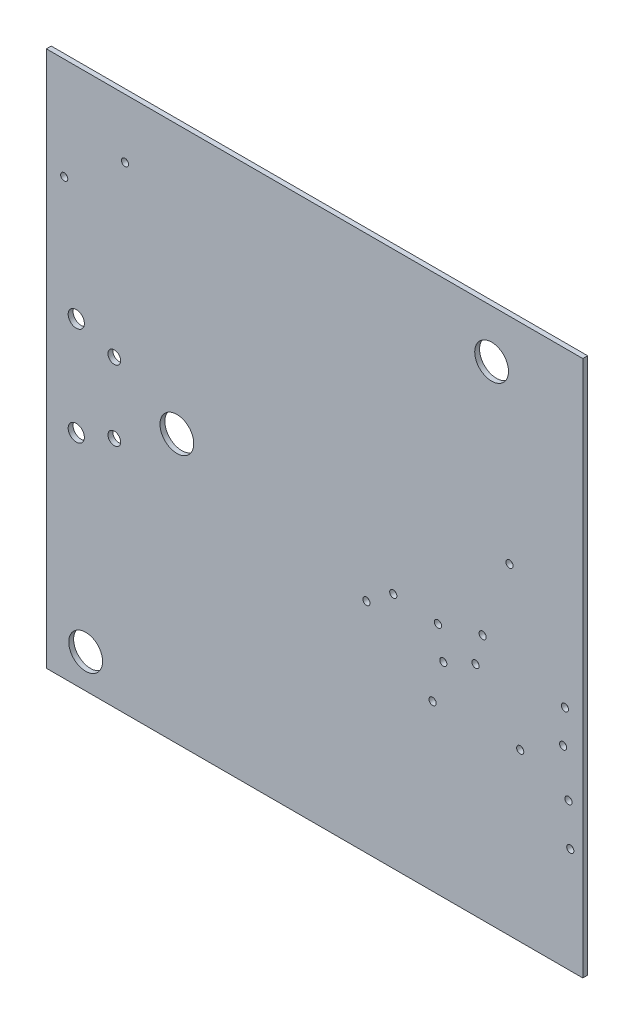
ISO-10303-21;
HEADER;
FILE_DESCRIPTION(('STEP AP214'),'2;1');
FILE_NAME('part.step','',(''),(''),'','','');
FILE_SCHEMA(('AUTOMOTIVE_DESIGN { 1 0 10303 214 1 1 1 1 }'));
ENDSEC;
DATA;
#1=APPLICATION_CONTEXT('core data for automotive mechanical design processes');
#2=APPLICATION_PROTOCOL_DEFINITION('international standard','automotive_design',2000,#1);
#3=PRODUCT_CONTEXT('',#1,'mechanical');
#4=PRODUCT('Part','Part','',(#3));
#5=PRODUCT_RELATED_PRODUCT_CATEGORY('part','',(#4));
#6=PRODUCT_DEFINITION_FORMATION('','',#4);
#7=PRODUCT_DEFINITION_CONTEXT('part definition',#1,'design');
#8=PRODUCT_DEFINITION('design','',#6,#7);
#9=PRODUCT_DEFINITION_SHAPE('','',#8);
#10=(LENGTH_UNIT() NAMED_UNIT(*) SI_UNIT(.MILLI.,.METRE.));
#11=(NAMED_UNIT(*) PLANE_ANGLE_UNIT() SI_UNIT($,.RADIAN.));
#12=(NAMED_UNIT(*) SI_UNIT($,.STERADIAN.) SOLID_ANGLE_UNIT());
#13=UNCERTAINTY_MEASURE_WITH_UNIT(LENGTH_MEASURE(1.E-05),#10,'distance_accuracy_value','');
#14=(GEOMETRIC_REPRESENTATION_CONTEXT(3) GLOBAL_UNCERTAINTY_ASSIGNED_CONTEXT((#13)) GLOBAL_UNIT_ASSIGNED_CONTEXT((#10,
#11,#12)) REPRESENTATION_CONTEXT('',''));
#15=CARTESIAN_POINT('',(0.,0.,0.));
#16=DIRECTION('',(0.,0.,1.));
#17=DIRECTION('',(1.,0.,0.));
#18=AXIS2_PLACEMENT_3D('',#15,#16,#17);
#19=CARTESIAN_POINT('',(0.,0.,0.));
#20=DIRECTION('',(0.,0.,-1.));
#21=DIRECTION('',(-1.,0.,0.));
#22=AXIS2_PLACEMENT_3D('',#19,#20,#21);
#23=PLANE('',#22);
#24=CARTESIAN_POINT('',(32.893,22.86,0.));
#25=DIRECTION('',(0.,0.,-1.));
#26=DIRECTION('',(-1.,0.,0.));
#27=AXIS2_PLACEMENT_3D('',#24,#25,#26);
#28=CIRCLE('',#27,0.254);
#29=CARTESIAN_POINT('',(32.639,22.86,0.));
#30=VERTEX_POINT('',#29);
#31=EDGE_CURVE('E145',#30,#30,#28,.T.);
#32=ORIENTED_EDGE('',*,*,#31,.T.);
#33=EDGE_LOOP('',(#32));
#34=FACE_BOUND('',#33,.T.);
#35=CARTESIAN_POINT('',(31.623,34.671,0.));
#36=DIRECTION('',(0.,0.,-1.));
#37=DIRECTION('',(-1.,0.,0.));
#38=AXIS2_PLACEMENT_3D('',#35,#36,#37);
#39=CIRCLE('',#38,1.20000014);
#40=CARTESIAN_POINT('',(30.42299986,34.671,0.));
#41=VERTEX_POINT('',#40);
#42=EDGE_CURVE('E149',#41,#41,#39,.T.);
#43=ORIENTED_EDGE('',*,*,#42,.T.);
#44=EDGE_LOOP('',(#43));
#45=FACE_BOUND('',#44,.T.);
#46=CARTESIAN_POINT('',(36.83,16.002,0.));
#47=DIRECTION('',(0.,0.,-1.));
#48=DIRECTION('',(-1.,0.,0.));
#49=AXIS2_PLACEMENT_3D('',#46,#47,#48);
#50=CIRCLE('',#49,0.254);
#51=CARTESIAN_POINT('',(36.576,16.002,0.));
#52=VERTEX_POINT('',#51);
#53=EDGE_CURVE('E152',#52,#52,#50,.T.);
#54=ORIENTED_EDGE('',*,*,#53,.T.);
#55=EDGE_LOOP('',(#54));
#56=FACE_BOUND('',#55,.T.);
#57=CARTESIAN_POINT('',(30.988,17.526,0.));
#58=DIRECTION('',(0.,0.,-1.));
#59=DIRECTION('',(-1.,0.,0.));
#60=AXIS2_PLACEMENT_3D('',#57,#58,#59);
#61=CIRCLE('',#60,0.254);
#62=CARTESIAN_POINT('',(30.734,17.526,0.));
#63=VERTEX_POINT('',#62);
#64=EDGE_CURVE('E155',#63,#63,#61,.T.);
#65=ORIENTED_EDGE('',*,*,#64,.T.);
#66=EDGE_LOOP('',(#65));
#67=FACE_BOUND('',#66,.T.);
#68=CARTESIAN_POINT('',(27.813,16.637,0.));
#69=DIRECTION('',(0.,0.,-1.));
#70=DIRECTION('',(-1.,0.,0.));
#71=AXIS2_PLACEMENT_3D('',#68,#69,#70);
#72=CIRCLE('',#71,0.254);
#73=CARTESIAN_POINT('',(27.559,16.637,0.));
#74=VERTEX_POINT('',#73);
#75=EDGE_CURVE('E158',#74,#74,#72,.T.);
#76=ORIENTED_EDGE('',*,*,#75,.T.);
#77=EDGE_LOOP('',(#76));
#78=FACE_BOUND('',#77,.T.);
#79=CARTESIAN_POINT('',(30.48,15.494,0.));
#80=DIRECTION('',(0.,0.,-1.));
#81=DIRECTION('',(-1.,0.,0.));
#82=AXIS2_PLACEMENT_3D('',#79,#80,#81);
#83=CIRCLE('',#82,0.254);
#84=CARTESIAN_POINT('',(30.226,15.494,0.));
#85=VERTEX_POINT('',#84);
#86=EDGE_CURVE('E161',#85,#85,#83,.T.);
#87=ORIENTED_EDGE('',*,*,#86,.T.);
#88=EDGE_LOOP('',(#87));
#89=FACE_BOUND('',#88,.T.);
#90=CARTESIAN_POINT('',(37.084,10.414,0.));
#91=DIRECTION('',(0.,0.,-1.));
#92=DIRECTION('',(-1.,0.,0.));
#93=AXIS2_PLACEMENT_3D('',#90,#91,#92);
#94=CIRCLE('',#93,0.254);
#95=CARTESIAN_POINT('',(36.83,10.414,0.));
#96=VERTEX_POINT('',#95);
#97=EDGE_CURVE('E164',#96,#96,#94,.T.);
#98=ORIENTED_EDGE('',*,*,#97,.T.);
#99=EDGE_LOOP('',(#98));
#100=FACE_BOUND('',#99,.T.);
#101=CARTESIAN_POINT('',(36.703,13.589,0.));
#102=DIRECTION('',(0.,0.,-1.));
#103=DIRECTION('',(-1.,0.,0.));
#104=AXIS2_PLACEMENT_3D('',#101,#102,#103);
#105=CIRCLE('',#104,0.254);
#106=CARTESIAN_POINT('',(36.449,13.589,0.));
#107=VERTEX_POINT('',#106);
#108=EDGE_CURVE('E167',#107,#107,#105,.T.);
#109=ORIENTED_EDGE('',*,*,#108,.T.);
#110=EDGE_LOOP('',(#109));
#111=FACE_BOUND('',#110,.T.);
#112=CARTESIAN_POINT('',(37.211,7.493,0.));
#113=DIRECTION('',(0.,0.,-1.));
#114=DIRECTION('',(-1.,0.,0.));
#115=AXIS2_PLACEMENT_3D('',#112,#113,#114);
#116=CIRCLE('',#115,0.254);
#117=CARTESIAN_POINT('',(36.957,7.493,0.));
#118=VERTEX_POINT('',#117);
#119=EDGE_CURVE('E170',#118,#118,#116,.T.);
#120=ORIENTED_EDGE('',*,*,#119,.T.);
#121=EDGE_LOOP('',(#120));
#122=FACE_BOUND('',#121,.T.);
#123=CARTESIAN_POINT('',(28.194,14.478,0.));
#124=DIRECTION('',(0.,0.,-1.));
#125=DIRECTION('',(-1.,0.,0.));
#126=AXIS2_PLACEMENT_3D('',#123,#124,#125);
#127=CIRCLE('',#126,0.254);
#128=CARTESIAN_POINT('',(27.94,14.478,0.));
#129=VERTEX_POINT('',#128);
#130=EDGE_CURVE('E173',#129,#129,#127,.T.);
#131=ORIENTED_EDGE('',*,*,#130,.T.);
#132=EDGE_LOOP('',(#131));
#133=FACE_BOUND('',#132,.T.);
#134=CARTESIAN_POINT('',(33.655,11.811,0.));
#135=DIRECTION('',(0.,0.,-1.));
#136=DIRECTION('',(-1.,0.,0.));
#137=AXIS2_PLACEMENT_3D('',#134,#135,#136);
#138=CIRCLE('',#137,0.254);
#139=CARTESIAN_POINT('',(33.401,11.811,0.));
#140=VERTEX_POINT('',#139);
#141=EDGE_CURVE('E176',#140,#140,#138,.T.);
#142=ORIENTED_EDGE('',*,*,#141,.T.);
#143=EDGE_LOOP('',(#142));
#144=FACE_BOUND('',#143,.T.);
#145=CARTESIAN_POINT('',(9.271,19.05,0.));
#146=DIRECTION('',(0.,0.,-1.));
#147=DIRECTION('',(-1.,0.,0.));
#148=AXIS2_PLACEMENT_3D('',#145,#146,#147);
#149=CIRCLE('',#148,1.20000014);
#150=CARTESIAN_POINT('',(8.07099986,19.05,0.));
#151=VERTEX_POINT('',#150);
#152=EDGE_CURVE('E179',#151,#151,#149,.T.);
#153=ORIENTED_EDGE('',*,*,#152,.T.);
#154=EDGE_LOOP('',(#153));
#155=FACE_BOUND('',#154,.T.);
#156=CARTESIAN_POINT('',(5.588,33.909,0.));
#157=DIRECTION('',(0.,0.,-1.));
#158=DIRECTION('',(-1.,0.,0.));
#159=AXIS2_PLACEMENT_3D('',#156,#157,#158);
#160=CIRCLE('',#159,0.254);
#161=CARTESIAN_POINT('',(5.334,33.909,0.));
#162=VERTEX_POINT('',#161);
#163=EDGE_CURVE('E182',#162,#162,#160,.T.);
#164=ORIENTED_EDGE('',*,*,#163,.T.);
#165=EDGE_LOOP('',(#164));
#166=FACE_BOUND('',#165,.T.);
#167=CARTESIAN_POINT('',(24.638,16.891,0.));
#168=DIRECTION('',(0.,0.,-1.));
#169=DIRECTION('',(-1.,0.,0.));
#170=AXIS2_PLACEMENT_3D('',#167,#168,#169);
#171=CIRCLE('',#170,0.254);
#172=CARTESIAN_POINT('',(24.384,16.891,0.));
#173=VERTEX_POINT('',#172);
#174=EDGE_CURVE('E185',#173,#173,#171,.T.);
#175=ORIENTED_EDGE('',*,*,#174,.T.);
#176=EDGE_LOOP('',(#175));
#177=FACE_BOUND('',#176,.T.);
#178=CARTESIAN_POINT('',(2.12600032,22.55000062,0.));
#179=DIRECTION('',(0.,0.,-1.));
#180=DIRECTION('',(-1.,0.,0.));
#181=AXIS2_PLACEMENT_3D('',#178,#179,#180);
#182=CIRCLE('',#181,0.57500012);
#183=CARTESIAN_POINT('',(1.5510002,22.55000062,0.));
#184=VERTEX_POINT('',#183);
#185=EDGE_CURVE('E188',#184,#184,#182,.T.);
#186=ORIENTED_EDGE('',*,*,#185,.T.);
#187=EDGE_LOOP('',(#186));
#188=FACE_BOUND('',#187,.T.);
#189=CARTESIAN_POINT('',(1.27,30.861,0.));
#190=DIRECTION('',(0.,0.,-1.));
#191=DIRECTION('',(-1.,0.,0.));
#192=AXIS2_PLACEMENT_3D('',#189,#190,#191);
#193=CIRCLE('',#192,0.254);
#194=CARTESIAN_POINT('',(1.016,30.861,0.));
#195=VERTEX_POINT('',#194);
#196=EDGE_CURVE('E191',#195,#195,#193,.T.);
#197=ORIENTED_EDGE('',*,*,#196,.T.);
#198=EDGE_LOOP('',(#197));
#199=FACE_BOUND('',#198,.T.);
#200=CARTESIAN_POINT('',(4.826,21.55000008,0.));
#201=DIRECTION('',(0.,0.,-1.));
#202=DIRECTION('',(-1.,0.,0.));
#203=AXIS2_PLACEMENT_3D('',#200,#201,#202);
#204=CIRCLE('',#203,0.4499991);
#205=CARTESIAN_POINT('',(4.3760009,21.55000008,0.));
#206=VERTEX_POINT('',#205);
#207=EDGE_CURVE('E194',#206,#206,#204,.T.);
#208=ORIENTED_EDGE('',*,*,#207,.T.);
#209=EDGE_LOOP('',(#208));
#210=FACE_BOUND('',#209,.T.);
#211=CARTESIAN_POINT('',(22.733,15.494,0.));
#212=DIRECTION('',(0.,0.,-1.));
#213=DIRECTION('',(-1.,0.,0.));
#214=AXIS2_PLACEMENT_3D('',#211,#212,#213);
#215=CIRCLE('',#214,0.254);
#216=CARTESIAN_POINT('',(22.479,15.494,0.));
#217=VERTEX_POINT('',#216);
#218=EDGE_CURVE('E197',#217,#217,#215,.T.);
#219=ORIENTED_EDGE('',*,*,#218,.T.);
#220=EDGE_LOOP('',(#219));
#221=FACE_BOUND('',#220,.T.);
#222=CARTESIAN_POINT('',(4.826,16.54999992,0.));
#223=DIRECTION('',(0.,0.,-1.));
#224=DIRECTION('',(-1.,0.,0.));
#225=AXIS2_PLACEMENT_3D('',#222,#223,#224);
#226=CIRCLE('',#225,0.4499991);
#227=CARTESIAN_POINT('',(4.3760009,16.54999992,0.));
#228=VERTEX_POINT('',#227);
#229=EDGE_CURVE('E200',#228,#228,#226,.T.);
#230=ORIENTED_EDGE('',*,*,#229,.T.);
#231=EDGE_LOOP('',(#230));
#232=FACE_BOUND('',#231,.T.);
#233=CARTESIAN_POINT('',(27.432,11.684,0.));
#234=DIRECTION('',(0.,0.,-1.));
#235=DIRECTION('',(-1.,0.,0.));
#236=AXIS2_PLACEMENT_3D('',#233,#234,#235);
#237=CIRCLE('',#236,0.254);
#238=CARTESIAN_POINT('',(27.178,11.684,0.));
#239=VERTEX_POINT('',#238);
#240=EDGE_CURVE('E203',#239,#239,#237,.T.);
#241=ORIENTED_EDGE('',*,*,#240,.T.);
#242=EDGE_LOOP('',(#241));
#243=FACE_BOUND('',#242,.T.);
#244=CARTESIAN_POINT('',(2.12600032,15.54999938,0.));
#245=DIRECTION('',(0.,0.,-1.));
#246=DIRECTION('',(-1.,0.,0.));
#247=AXIS2_PLACEMENT_3D('',#244,#245,#246);
#248=CIRCLE('',#247,0.57500012);
#249=CARTESIAN_POINT('',(1.5510002,15.54999938,0.));
#250=VERTEX_POINT('',#249);
#251=EDGE_CURVE('E205',#250,#250,#248,.T.);
#252=ORIENTED_EDGE('',*,*,#251,.T.);
#253=EDGE_LOOP('',(#252));
#254=FACE_BOUND('',#253,.T.);
#255=CARTESIAN_POINT('',(2.794,2.413,0.));
#256=DIRECTION('',(0.,0.,-1.));
#257=DIRECTION('',(-1.,0.,0.));
#258=AXIS2_PLACEMENT_3D('',#255,#256,#257);
#259=CIRCLE('',#258,1.20000014);
#260=CARTESIAN_POINT('',(1.59399986,2.413,0.));
#261=VERTEX_POINT('',#260);
#262=EDGE_CURVE('E20',#261,#261,#259,.T.);
#263=ORIENTED_EDGE('',*,*,#262,.T.);
#264=EDGE_LOOP('',(#263));
#265=FACE_BOUND('',#264,.T.);
#266=DIRECTION('',(0.,1.,0.));
#267=VECTOR('',#266,1.);
#268=CARTESIAN_POINT('',(38.099998474121,0.,0.));
#269=LINE('',#268,#267);
#270=CARTESIAN_POINT('',(38.099998474121,0.,0.));
#271=VERTEX_POINT('',#270);
#272=CARTESIAN_POINT('',(38.099998474121,38.099998474121,0.));
#273=VERTEX_POINT('',#272);
#274=EDGE_CURVE('E55',#271,#273,#269,.T.);
#275=ORIENTED_EDGE('',*,*,#274,.T.);
#276=DIRECTION('',(1.,0.,0.));
#277=VECTOR('',#276,1.);
#278=CARTESIAN_POINT('',(38.099998474121,38.099998474121,0.));
#279=LINE('',#278,#277);
#280=CARTESIAN_POINT('',(0.,38.099998474121,0.));
#281=VERTEX_POINT('',#280);
#282=EDGE_CURVE('E57',#273,#281,#279,.F.);
#283=ORIENTED_EDGE('',*,*,#282,.T.);
#284=DIRECTION('',(0.,1.,0.));
#285=VECTOR('',#284,1.);
#286=CARTESIAN_POINT('',(0.,38.099998474121,0.));
#287=LINE('',#286,#285);
#288=CARTESIAN_POINT('',(0.,0.,0.));
#289=VERTEX_POINT('',#288);
#290=EDGE_CURVE('E59',#281,#289,#287,.F.);
#291=ORIENTED_EDGE('',*,*,#290,.T.);
#292=DIRECTION('',(1.,0.,0.));
#293=VECTOR('',#292,1.);
#294=CARTESIAN_POINT('',(0.,0.,0.));
#295=LINE('',#294,#293);
#296=EDGE_CURVE('E212',#289,#271,#295,.T.);
#297=ORIENTED_EDGE('',*,*,#296,.T.);
#298=EDGE_LOOP('',(#275,#283,#291,#297));
#299=FACE_BOUND('',#298,.T.);
#300=ADVANCED_FACE('F17',(#34,#45,#56,#67,#78,#89,#100,#111,#122,#133,#144,#155,#166,#177,#188,
#199,#210,#221,#232,#243,#254,#265,#299),#23,.F.);
#301=CARTESIAN_POINT('',(0.,38.099998474121,-0.34544));
#302=DIRECTION('',(1.,0.,0.));
#303=DIRECTION('',(0.,0.,-1.));
#304=AXIS2_PLACEMENT_3D('',#301,#302,#303);
#305=PLANE('',#304);
#306=DIRECTION('',(0.,0.,1.));
#307=VECTOR('',#306,1.);
#308=CARTESIAN_POINT('',(0.,0.,-0.34544));
#309=LINE('',#308,#307);
#310=CARTESIAN_POINT('',(0.,0.,-0.34544));
#311=VERTEX_POINT('',#310);
#312=EDGE_CURVE('E70',#311,#289,#309,.T.);
#313=ORIENTED_EDGE('',*,*,#312,.T.);
#314=ORIENTED_EDGE('',*,*,#290,.F.);
#315=DIRECTION('',(0.,0.,-1.));
#316=VECTOR('',#315,1.);
#317=CARTESIAN_POINT('',(0.,38.099998474121,-0.34544));
#318=LINE('',#317,#316);
#319=CARTESIAN_POINT('',(0.,38.099998474121,-0.34544));
#320=VERTEX_POINT('',#319);
#321=EDGE_CURVE('E64',#281,#320,#318,.T.);
#322=ORIENTED_EDGE('',*,*,#321,.T.);
#323=DIRECTION('',(0.,1.,0.));
#324=VECTOR('',#323,1.);
#325=CARTESIAN_POINT('',(0.,0.,-0.34544));
#326=LINE('',#325,#324);
#327=EDGE_CURVE('E148',#311,#320,#326,.T.);
#328=ORIENTED_EDGE('',*,*,#327,.F.);
#329=EDGE_LOOP('',(#313,#314,#322,#328));
#330=FACE_BOUND('',#329,.T.);
#331=ADVANCED_FACE('F67',(#330),#305,.F.);
#332=CARTESIAN_POINT('',(38.099998474121,38.099998474121,-0.34544));
#333=DIRECTION('',(0.,-1.,0.));
#334=DIRECTION('',(0.,0.,-1.));
#335=AXIS2_PLACEMENT_3D('',#332,#333,#334);
#336=PLANE('',#335);
#337=ORIENTED_EDGE('',*,*,#321,.F.);
#338=ORIENTED_EDGE('',*,*,#282,.F.);
#339=DIRECTION('',(0.,0.,1.));
#340=VECTOR('',#339,1.);
#341=CARTESIAN_POINT('',(38.099998474121,38.099998474121,-0.34544));
#342=LINE('',#341,#340);
#343=CARTESIAN_POINT('',(38.099998474121,38.099998474121,-0.34544));
#344=VERTEX_POINT('',#343);
#345=EDGE_CURVE('E78',#273,#344,#342,.F.);
#346=ORIENTED_EDGE('',*,*,#345,.T.);
#347=DIRECTION('',(-1.,0.,0.));
#348=VECTOR('',#347,1.);
#349=CARTESIAN_POINT('',(0.,38.099998474121,-0.34544));
#350=LINE('',#349,#348);
#351=EDGE_CURVE('E75',#320,#344,#350,.F.);
#352=ORIENTED_EDGE('',*,*,#351,.F.);
#353=EDGE_LOOP('',(#337,#338,#346,#352));
#354=FACE_BOUND('',#353,.T.);
#355=ADVANCED_FACE('F73',(#354),#336,.F.);
#356=CARTESIAN_POINT('',(38.099998474121,0.,-0.34544));
#357=DIRECTION('',(-1.,0.,0.));
#358=DIRECTION('',(0.,0.,1.));
#359=AXIS2_PLACEMENT_3D('',#356,#357,#358);
#360=PLANE('',#359);
#361=ORIENTED_EDGE('',*,*,#345,.F.);
#362=ORIENTED_EDGE('',*,*,#274,.F.);
#363=DIRECTION('',(0.,0.,1.));
#364=VECTOR('',#363,1.);
#365=CARTESIAN_POINT('',(38.099998474121,0.,-0.34544));
#366=LINE('',#365,#364);
#367=CARTESIAN_POINT('',(38.099998474121,0.,-0.34544));
#368=VERTEX_POINT('',#367);
#369=EDGE_CURVE('E35',#271,#368,#366,.F.);
#370=ORIENTED_EDGE('',*,*,#369,.T.);
#371=DIRECTION('',(0.,1.,0.));
#372=VECTOR('',#371,1.);
#373=CARTESIAN_POINT('',(38.099998474121,0.,-0.34544));
#374=LINE('',#373,#372);
#375=EDGE_CURVE('E219',#344,#368,#374,.F.);
#376=ORIENTED_EDGE('',*,*,#375,.F.);
#377=EDGE_LOOP('',(#361,#362,#370,#376));
#378=FACE_BOUND('',#377,.T.);
#379=ADVANCED_FACE('F220',(#378),#360,.F.);
#380=CARTESIAN_POINT('',(0.,0.,-0.34544));
#381=DIRECTION('',(0.,1.,0.));
#382=DIRECTION('',(0.,0.,1.));
#383=AXIS2_PLACEMENT_3D('',#380,#381,#382);
#384=PLANE('',#383);
#385=ORIENTED_EDGE('',*,*,#369,.F.);
#386=ORIENTED_EDGE('',*,*,#296,.F.);
#387=ORIENTED_EDGE('',*,*,#312,.F.);
#388=DIRECTION('',(-1.,0.,0.));
#389=VECTOR('',#388,1.);
#390=CARTESIAN_POINT('',(0.,0.,-0.34544));
#391=LINE('',#390,#389);
#392=EDGE_CURVE('E144',#368,#311,#391,.T.);
#393=ORIENTED_EDGE('',*,*,#392,.F.);
#394=EDGE_LOOP('',(#385,#386,#387,#393));
#395=FACE_BOUND('',#394,.T.);
#396=ADVANCED_FACE('F227',(#395),#384,.F.);
#397=CARTESIAN_POINT('',(2.794,2.413,-0.34544));
#398=DIRECTION('',(0.,0.,-1.));
#399=DIRECTION('',(-1.,0.,0.));
#400=AXIS2_PLACEMENT_3D('',#397,#398,#399);
#401=CYLINDRICAL_SURFACE('',#400,1.20000014);
#402=ORIENTED_EDGE('',*,*,#262,.F.);
#403=EDGE_LOOP('',(#402));
#404=FACE_BOUND('',#403,.T.);
#405=CARTESIAN_POINT('',(2.794,2.413,-0.34544));
#406=DIRECTION('',(0.,0.,-1.));
#407=DIRECTION('',(-1.,0.,0.));
#408=AXIS2_PLACEMENT_3D('',#405,#406,#407);
#409=CIRCLE('',#408,1.20000014);
#410=CARTESIAN_POINT('',(1.59399986,2.413,-0.34544));
#411=VERTEX_POINT('',#410);
#412=EDGE_CURVE('E141',#411,#411,#409,.F.);
#413=ORIENTED_EDGE('',*,*,#412,.F.);
#414=EDGE_LOOP('',(#413));
#415=FACE_BOUND('',#414,.T.);
#416=ADVANCED_FACE('F229',(#404,#415),#401,.F.);
#417=CARTESIAN_POINT('',(2.12600032,15.54999938,-0.34544));
#418=DIRECTION('',(0.,0.,-1.));
#419=DIRECTION('',(-1.,0.,0.));
#420=AXIS2_PLACEMENT_3D('',#417,#418,#419);
#421=CYLINDRICAL_SURFACE('',#420,0.57500012);
#422=ORIENTED_EDGE('',*,*,#251,.F.);
#423=EDGE_LOOP('',(#422));
#424=FACE_BOUND('',#423,.T.);
#425=CARTESIAN_POINT('',(2.12600032,15.54999938,-0.34544));
#426=DIRECTION('',(0.,0.,-1.));
#427=DIRECTION('',(-1.,0.,0.));
#428=AXIS2_PLACEMENT_3D('',#425,#426,#427);
#429=CIRCLE('',#428,0.57500012);
#430=CARTESIAN_POINT('',(1.5510002,15.54999938,-0.34544));
#431=VERTEX_POINT('',#430);
#432=EDGE_CURVE('E138',#431,#431,#429,.F.);
#433=ORIENTED_EDGE('',*,*,#432,.F.);
#434=EDGE_LOOP('',(#433));
#435=FACE_BOUND('',#434,.T.);
#436=ADVANCED_FACE('F236',(#424,#435),#421,.F.);
#437=CARTESIAN_POINT('',(27.432,11.684,-0.34544));
#438=DIRECTION('',(0.,0.,-1.));
#439=DIRECTION('',(-1.,0.,0.));
#440=AXIS2_PLACEMENT_3D('',#437,#438,#439);
#441=CYLINDRICAL_SURFACE('',#440,0.254);
#442=ORIENTED_EDGE('',*,*,#240,.F.);
#443=EDGE_LOOP('',(#442));
#444=FACE_BOUND('',#443,.T.);
#445=CARTESIAN_POINT('',(27.432,11.684,-0.34544));
#446=DIRECTION('',(0.,0.,-1.));
#447=DIRECTION('',(-1.,0.,0.));
#448=AXIS2_PLACEMENT_3D('',#445,#446,#447);
#449=CIRCLE('',#448,0.254);
#450=CARTESIAN_POINT('',(27.178,11.684,-0.34544));
#451=VERTEX_POINT('',#450);
#452=EDGE_CURVE('E135',#451,#451,#449,.F.);
#453=ORIENTED_EDGE('',*,*,#452,.F.);
#454=EDGE_LOOP('',(#453));
#455=FACE_BOUND('',#454,.T.);
#456=ADVANCED_FACE('F322',(#444,#455),#441,.F.);
#457=CARTESIAN_POINT('',(4.826,16.54999992,-0.34544));
#458=DIRECTION('',(0.,0.,-1.));
#459=DIRECTION('',(-1.,0.,0.));
#460=AXIS2_PLACEMENT_3D('',#457,#458,#459);
#461=CYLINDRICAL_SURFACE('',#460,0.4499991);
#462=ORIENTED_EDGE('',*,*,#229,.F.);
#463=EDGE_LOOP('',(#462));
#464=FACE_BOUND('',#463,.T.);
#465=CARTESIAN_POINT('',(4.826,16.54999992,-0.34544));
#466=DIRECTION('',(0.,0.,-1.));
#467=DIRECTION('',(-1.,0.,0.));
#468=AXIS2_PLACEMENT_3D('',#465,#466,#467);
#469=CIRCLE('',#468,0.4499991);
#470=CARTESIAN_POINT('',(4.3760009,16.54999992,-0.34544));
#471=VERTEX_POINT('',#470);
#472=EDGE_CURVE('E132',#471,#471,#469,.F.);
#473=ORIENTED_EDGE('',*,*,#472,.F.);
#474=EDGE_LOOP('',(#473));
#475=FACE_BOUND('',#474,.T.);
#476=ADVANCED_FACE('F318',(#464,#475),#461,.F.);
#477=CARTESIAN_POINT('',(22.733,15.494,-0.34544));
#478=DIRECTION('',(0.,0.,-1.));
#479=DIRECTION('',(-1.,0.,0.));
#480=AXIS2_PLACEMENT_3D('',#477,#478,#479);
#481=CYLINDRICAL_SURFACE('',#480,0.254);
#482=ORIENTED_EDGE('',*,*,#218,.F.);
#483=EDGE_LOOP('',(#482));
#484=FACE_BOUND('',#483,.T.);
#485=CARTESIAN_POINT('',(22.733,15.494,-0.34544));
#486=DIRECTION('',(0.,0.,-1.));
#487=DIRECTION('',(-1.,0.,0.));
#488=AXIS2_PLACEMENT_3D('',#485,#486,#487);
#489=CIRCLE('',#488,0.254);
#490=CARTESIAN_POINT('',(22.479,15.494,-0.34544));
#491=VERTEX_POINT('',#490);
#492=EDGE_CURVE('E129',#491,#491,#489,.F.);
#493=ORIENTED_EDGE('',*,*,#492,.F.);
#494=EDGE_LOOP('',(#493));
#495=FACE_BOUND('',#494,.T.);
#496=ADVANCED_FACE('F314',(#484,#495),#481,.F.);
#497=CARTESIAN_POINT('',(4.826,21.55000008,-0.34544));
#498=DIRECTION('',(0.,0.,-1.));
#499=DIRECTION('',(-1.,0.,0.));
#500=AXIS2_PLACEMENT_3D('',#497,#498,#499);
#501=CYLINDRICAL_SURFACE('',#500,0.4499991);
#502=ORIENTED_EDGE('',*,*,#207,.F.);
#503=EDGE_LOOP('',(#502));
#504=FACE_BOUND('',#503,.T.);
#505=CARTESIAN_POINT('',(4.826,21.55000008,-0.34544));
#506=DIRECTION('',(0.,0.,-1.));
#507=DIRECTION('',(-1.,0.,0.));
#508=AXIS2_PLACEMENT_3D('',#505,#506,#507);
#509=CIRCLE('',#508,0.4499991);
#510=CARTESIAN_POINT('',(4.3760009,21.55000008,-0.34544));
#511=VERTEX_POINT('',#510);
#512=EDGE_CURVE('E126',#511,#511,#509,.F.);
#513=ORIENTED_EDGE('',*,*,#512,.F.);
#514=EDGE_LOOP('',(#513));
#515=FACE_BOUND('',#514,.T.);
#516=ADVANCED_FACE('F310',(#504,#515),#501,.F.);
#517=CARTESIAN_POINT('',(1.27,30.861,-0.34544));
#518=DIRECTION('',(0.,0.,-1.));
#519=DIRECTION('',(-1.,0.,0.));
#520=AXIS2_PLACEMENT_3D('',#517,#518,#519);
#521=CYLINDRICAL_SURFACE('',#520,0.254);
#522=ORIENTED_EDGE('',*,*,#196,.F.);
#523=EDGE_LOOP('',(#522));
#524=FACE_BOUND('',#523,.T.);
#525=CARTESIAN_POINT('',(1.27,30.861,-0.34544));
#526=DIRECTION('',(0.,0.,-1.));
#527=DIRECTION('',(-1.,0.,0.));
#528=AXIS2_PLACEMENT_3D('',#525,#526,#527);
#529=CIRCLE('',#528,0.254);
#530=CARTESIAN_POINT('',(1.016,30.861,-0.34544));
#531=VERTEX_POINT('',#530);
#532=EDGE_CURVE('E123',#531,#531,#529,.F.);
#533=ORIENTED_EDGE('',*,*,#532,.F.);
#534=EDGE_LOOP('',(#533));
#535=FACE_BOUND('',#534,.T.);
#536=ADVANCED_FACE('F306',(#524,#535),#521,.F.);
#537=CARTESIAN_POINT('',(2.12600032,22.55000062,-0.34544));
#538=DIRECTION('',(0.,0.,-1.));
#539=DIRECTION('',(-1.,0.,0.));
#540=AXIS2_PLACEMENT_3D('',#537,#538,#539);
#541=CYLINDRICAL_SURFACE('',#540,0.57500012);
#542=ORIENTED_EDGE('',*,*,#185,.F.);
#543=EDGE_LOOP('',(#542));
#544=FACE_BOUND('',#543,.T.);
#545=CARTESIAN_POINT('',(2.12600032,22.55000062,-0.34544));
#546=DIRECTION('',(0.,0.,-1.));
#547=DIRECTION('',(-1.,0.,0.));
#548=AXIS2_PLACEMENT_3D('',#545,#546,#547);
#549=CIRCLE('',#548,0.57500012);
#550=CARTESIAN_POINT('',(1.5510002,22.55000062,-0.34544));
#551=VERTEX_POINT('',#550);
#552=EDGE_CURVE('E120',#551,#551,#549,.F.);
#553=ORIENTED_EDGE('',*,*,#552,.F.);
#554=EDGE_LOOP('',(#553));
#555=FACE_BOUND('',#554,.T.);
#556=ADVANCED_FACE('F302',(#544,#555),#541,.F.);
#557=CARTESIAN_POINT('',(24.638,16.891,-0.34544));
#558=DIRECTION('',(0.,0.,-1.));
#559=DIRECTION('',(-1.,0.,0.));
#560=AXIS2_PLACEMENT_3D('',#557,#558,#559);
#561=CYLINDRICAL_SURFACE('',#560,0.254);
#562=ORIENTED_EDGE('',*,*,#174,.F.);
#563=EDGE_LOOP('',(#562));
#564=FACE_BOUND('',#563,.T.);
#565=CARTESIAN_POINT('',(24.638,16.891,-0.34544));
#566=DIRECTION('',(0.,0.,-1.));
#567=DIRECTION('',(-1.,0.,0.));
#568=AXIS2_PLACEMENT_3D('',#565,#566,#567);
#569=CIRCLE('',#568,0.254);
#570=CARTESIAN_POINT('',(24.384,16.891,-0.34544));
#571=VERTEX_POINT('',#570);
#572=EDGE_CURVE('E117',#571,#571,#569,.F.);
#573=ORIENTED_EDGE('',*,*,#572,.F.);
#574=EDGE_LOOP('',(#573));
#575=FACE_BOUND('',#574,.T.);
#576=ADVANCED_FACE('F298',(#564,#575),#561,.F.);
#577=CARTESIAN_POINT('',(5.588,33.909,-0.34544));
#578=DIRECTION('',(0.,0.,-1.));
#579=DIRECTION('',(-1.,0.,0.));
#580=AXIS2_PLACEMENT_3D('',#577,#578,#579);
#581=CYLINDRICAL_SURFACE('',#580,0.254);
#582=ORIENTED_EDGE('',*,*,#163,.F.);
#583=EDGE_LOOP('',(#582));
#584=FACE_BOUND('',#583,.T.);
#585=CARTESIAN_POINT('',(5.588,33.909,-0.34544));
#586=DIRECTION('',(0.,0.,-1.));
#587=DIRECTION('',(-1.,0.,0.));
#588=AXIS2_PLACEMENT_3D('',#585,#586,#587);
#589=CIRCLE('',#588,0.254);
#590=CARTESIAN_POINT('',(5.334,33.909,-0.34544));
#591=VERTEX_POINT('',#590);
#592=EDGE_CURVE('E114',#591,#591,#589,.F.);
#593=ORIENTED_EDGE('',*,*,#592,.F.);
#594=EDGE_LOOP('',(#593));
#595=FACE_BOUND('',#594,.T.);
#596=ADVANCED_FACE('F294',(#584,#595),#581,.F.);
#597=CARTESIAN_POINT('',(9.271,19.05,-0.34544));
#598=DIRECTION('',(0.,0.,-1.));
#599=DIRECTION('',(-1.,0.,0.));
#600=AXIS2_PLACEMENT_3D('',#597,#598,#599);
#601=CYLINDRICAL_SURFACE('',#600,1.20000014);
#602=ORIENTED_EDGE('',*,*,#152,.F.);
#603=EDGE_LOOP('',(#602));
#604=FACE_BOUND('',#603,.T.);
#605=CARTESIAN_POINT('',(9.271,19.05,-0.34544));
#606=DIRECTION('',(0.,0.,-1.));
#607=DIRECTION('',(-1.,0.,0.));
#608=AXIS2_PLACEMENT_3D('',#605,#606,#607);
#609=CIRCLE('',#608,1.20000014);
#610=CARTESIAN_POINT('',(8.07099986,19.05,-0.34544));
#611=VERTEX_POINT('',#610);
#612=EDGE_CURVE('E111',#611,#611,#609,.F.);
#613=ORIENTED_EDGE('',*,*,#612,.F.);
#614=EDGE_LOOP('',(#613));
#615=FACE_BOUND('',#614,.T.);
#616=ADVANCED_FACE('F290',(#604,#615),#601,.F.);
#617=CARTESIAN_POINT('',(33.655,11.811,-0.34544));
#618=DIRECTION('',(0.,0.,-1.));
#619=DIRECTION('',(-1.,0.,0.));
#620=AXIS2_PLACEMENT_3D('',#617,#618,#619);
#621=CYLINDRICAL_SURFACE('',#620,0.254);
#622=ORIENTED_EDGE('',*,*,#141,.F.);
#623=EDGE_LOOP('',(#622));
#624=FACE_BOUND('',#623,.T.);
#625=CARTESIAN_POINT('',(33.655,11.811,-0.34544));
#626=DIRECTION('',(0.,0.,-1.));
#627=DIRECTION('',(-1.,0.,0.));
#628=AXIS2_PLACEMENT_3D('',#625,#626,#627);
#629=CIRCLE('',#628,0.254);
#630=CARTESIAN_POINT('',(33.401,11.811,-0.34544));
#631=VERTEX_POINT('',#630);
#632=EDGE_CURVE('E108',#631,#631,#629,.F.);
#633=ORIENTED_EDGE('',*,*,#632,.F.);
#634=EDGE_LOOP('',(#633));
#635=FACE_BOUND('',#634,.T.);
#636=ADVANCED_FACE('F286',(#624,#635),#621,.F.);
#637=CARTESIAN_POINT('',(28.194,14.478,-0.34544));
#638=DIRECTION('',(0.,0.,-1.));
#639=DIRECTION('',(-1.,0.,0.));
#640=AXIS2_PLACEMENT_3D('',#637,#638,#639);
#641=CYLINDRICAL_SURFACE('',#640,0.254);
#642=ORIENTED_EDGE('',*,*,#130,.F.);
#643=EDGE_LOOP('',(#642));
#644=FACE_BOUND('',#643,.T.);
#645=CARTESIAN_POINT('',(28.194,14.478,-0.34544));
#646=DIRECTION('',(0.,0.,-1.));
#647=DIRECTION('',(-1.,0.,0.));
#648=AXIS2_PLACEMENT_3D('',#645,#646,#647);
#649=CIRCLE('',#648,0.254);
#650=CARTESIAN_POINT('',(27.94,14.478,-0.34544));
#651=VERTEX_POINT('',#650);
#652=EDGE_CURVE('E105',#651,#651,#649,.F.);
#653=ORIENTED_EDGE('',*,*,#652,.F.);
#654=EDGE_LOOP('',(#653));
#655=FACE_BOUND('',#654,.T.);
#656=ADVANCED_FACE('F282',(#644,#655),#641,.F.);
#657=CARTESIAN_POINT('',(37.211,7.493,-0.34544));
#658=DIRECTION('',(0.,0.,-1.));
#659=DIRECTION('',(-1.,0.,0.));
#660=AXIS2_PLACEMENT_3D('',#657,#658,#659);
#661=CYLINDRICAL_SURFACE('',#660,0.254);
#662=ORIENTED_EDGE('',*,*,#119,.F.);
#663=EDGE_LOOP('',(#662));
#664=FACE_BOUND('',#663,.T.);
#665=CARTESIAN_POINT('',(37.211,7.493,-0.34544));
#666=DIRECTION('',(0.,0.,-1.));
#667=DIRECTION('',(-1.,0.,0.));
#668=AXIS2_PLACEMENT_3D('',#665,#666,#667);
#669=CIRCLE('',#668,0.254);
#670=CARTESIAN_POINT('',(36.957,7.493,-0.34544));
#671=VERTEX_POINT('',#670);
#672=EDGE_CURVE('E102',#671,#671,#669,.F.);
#673=ORIENTED_EDGE('',*,*,#672,.F.);
#674=EDGE_LOOP('',(#673));
#675=FACE_BOUND('',#674,.T.);
#676=ADVANCED_FACE('F278',(#664,#675),#661,.F.);
#677=CARTESIAN_POINT('',(36.703,13.589,-0.34544));
#678=DIRECTION('',(0.,0.,-1.));
#679=DIRECTION('',(-1.,0.,0.));
#680=AXIS2_PLACEMENT_3D('',#677,#678,#679);
#681=CYLINDRICAL_SURFACE('',#680,0.254);
#682=ORIENTED_EDGE('',*,*,#108,.F.);
#683=EDGE_LOOP('',(#682));
#684=FACE_BOUND('',#683,.T.);
#685=CARTESIAN_POINT('',(36.703,13.589,-0.34544));
#686=DIRECTION('',(0.,0.,-1.));
#687=DIRECTION('',(-1.,0.,0.));
#688=AXIS2_PLACEMENT_3D('',#685,#686,#687);
#689=CIRCLE('',#688,0.254);
#690=CARTESIAN_POINT('',(36.449,13.589,-0.34544));
#691=VERTEX_POINT('',#690);
#692=EDGE_CURVE('E99',#691,#691,#689,.F.);
#693=ORIENTED_EDGE('',*,*,#692,.F.);
#694=EDGE_LOOP('',(#693));
#695=FACE_BOUND('',#694,.T.);
#696=ADVANCED_FACE('F274',(#684,#695),#681,.F.);
#697=CARTESIAN_POINT('',(37.084,10.414,-0.34544));
#698=DIRECTION('',(0.,0.,-1.));
#699=DIRECTION('',(-1.,0.,0.));
#700=AXIS2_PLACEMENT_3D('',#697,#698,#699);
#701=CYLINDRICAL_SURFACE('',#700,0.254);
#702=ORIENTED_EDGE('',*,*,#97,.F.);
#703=EDGE_LOOP('',(#702));
#704=FACE_BOUND('',#703,.T.);
#705=CARTESIAN_POINT('',(37.084,10.414,-0.34544));
#706=DIRECTION('',(0.,0.,-1.));
#707=DIRECTION('',(-1.,0.,0.));
#708=AXIS2_PLACEMENT_3D('',#705,#706,#707);
#709=CIRCLE('',#708,0.254);
#710=CARTESIAN_POINT('',(36.83,10.414,-0.34544));
#711=VERTEX_POINT('',#710);
#712=EDGE_CURVE('E96',#711,#711,#709,.F.);
#713=ORIENTED_EDGE('',*,*,#712,.F.);
#714=EDGE_LOOP('',(#713));
#715=FACE_BOUND('',#714,.T.);
#716=ADVANCED_FACE('F270',(#704,#715),#701,.F.);
#717=CARTESIAN_POINT('',(30.48,15.494,-0.34544));
#718=DIRECTION('',(0.,0.,-1.));
#719=DIRECTION('',(-1.,0.,0.));
#720=AXIS2_PLACEMENT_3D('',#717,#718,#719);
#721=CYLINDRICAL_SURFACE('',#720,0.254);
#722=ORIENTED_EDGE('',*,*,#86,.F.);
#723=EDGE_LOOP('',(#722));
#724=FACE_BOUND('',#723,.T.);
#725=CARTESIAN_POINT('',(30.48,15.494,-0.34544));
#726=DIRECTION('',(0.,0.,-1.));
#727=DIRECTION('',(-1.,0.,0.));
#728=AXIS2_PLACEMENT_3D('',#725,#726,#727);
#729=CIRCLE('',#728,0.254);
#730=CARTESIAN_POINT('',(30.226,15.494,-0.34544));
#731=VERTEX_POINT('',#730);
#732=EDGE_CURVE('E93',#731,#731,#729,.F.);
#733=ORIENTED_EDGE('',*,*,#732,.F.);
#734=EDGE_LOOP('',(#733));
#735=FACE_BOUND('',#734,.T.);
#736=ADVANCED_FACE('F266',(#724,#735),#721,.F.);
#737=CARTESIAN_POINT('',(27.813,16.637,-0.34544));
#738=DIRECTION('',(0.,0.,-1.));
#739=DIRECTION('',(-1.,0.,0.));
#740=AXIS2_PLACEMENT_3D('',#737,#738,#739);
#741=CYLINDRICAL_SURFACE('',#740,0.254);
#742=ORIENTED_EDGE('',*,*,#75,.F.);
#743=EDGE_LOOP('',(#742));
#744=FACE_BOUND('',#743,.T.);
#745=CARTESIAN_POINT('',(27.813,16.637,-0.34544));
#746=DIRECTION('',(0.,0.,-1.));
#747=DIRECTION('',(-1.,0.,0.));
#748=AXIS2_PLACEMENT_3D('',#745,#746,#747);
#749=CIRCLE('',#748,0.254);
#750=CARTESIAN_POINT('',(27.559,16.637,-0.34544));
#751=VERTEX_POINT('',#750);
#752=EDGE_CURVE('E90',#751,#751,#749,.F.);
#753=ORIENTED_EDGE('',*,*,#752,.F.);
#754=EDGE_LOOP('',(#753));
#755=FACE_BOUND('',#754,.T.);
#756=ADVANCED_FACE('F262',(#744,#755),#741,.F.);
#757=CARTESIAN_POINT('',(30.988,17.526,-0.34544));
#758=DIRECTION('',(0.,0.,-1.));
#759=DIRECTION('',(-1.,0.,0.));
#760=AXIS2_PLACEMENT_3D('',#757,#758,#759);
#761=CYLINDRICAL_SURFACE('',#760,0.254);
#762=ORIENTED_EDGE('',*,*,#64,.F.);
#763=EDGE_LOOP('',(#762));
#764=FACE_BOUND('',#763,.T.);
#765=CARTESIAN_POINT('',(30.988,17.526,-0.34544));
#766=DIRECTION('',(0.,0.,-1.));
#767=DIRECTION('',(-1.,0.,0.));
#768=AXIS2_PLACEMENT_3D('',#765,#766,#767);
#769=CIRCLE('',#768,0.254);
#770=CARTESIAN_POINT('',(30.734,17.526,-0.34544));
#771=VERTEX_POINT('',#770);
#772=EDGE_CURVE('E87',#771,#771,#769,.F.);
#773=ORIENTED_EDGE('',*,*,#772,.F.);
#774=EDGE_LOOP('',(#773));
#775=FACE_BOUND('',#774,.T.);
#776=ADVANCED_FACE('F258',(#764,#775),#761,.F.);
#777=CARTESIAN_POINT('',(36.83,16.002,-0.34544));
#778=DIRECTION('',(0.,0.,-1.));
#779=DIRECTION('',(-1.,0.,0.));
#780=AXIS2_PLACEMENT_3D('',#777,#778,#779);
#781=CYLINDRICAL_SURFACE('',#780,0.254);
#782=ORIENTED_EDGE('',*,*,#53,.F.);
#783=EDGE_LOOP('',(#782));
#784=FACE_BOUND('',#783,.T.);
#785=CARTESIAN_POINT('',(36.83,16.002,-0.34544));
#786=DIRECTION('',(0.,0.,-1.));
#787=DIRECTION('',(-1.,0.,0.));
#788=AXIS2_PLACEMENT_3D('',#785,#786,#787);
#789=CIRCLE('',#788,0.254);
#790=CARTESIAN_POINT('',(36.576,16.002,-0.34544));
#791=VERTEX_POINT('',#790);
#792=EDGE_CURVE('E84',#791,#791,#789,.F.);
#793=ORIENTED_EDGE('',*,*,#792,.F.);
#794=EDGE_LOOP('',(#793));
#795=FACE_BOUND('',#794,.T.);
#796=ADVANCED_FACE('F254',(#784,#795),#781,.F.);
#797=CARTESIAN_POINT('',(31.623,34.671,-0.34544));
#798=DIRECTION('',(0.,0.,-1.));
#799=DIRECTION('',(-1.,0.,0.));
#800=AXIS2_PLACEMENT_3D('',#797,#798,#799);
#801=CYLINDRICAL_SURFACE('',#800,1.20000014);
#802=ORIENTED_EDGE('',*,*,#42,.F.);
#803=EDGE_LOOP('',(#802));
#804=FACE_BOUND('',#803,.T.);
#805=CARTESIAN_POINT('',(31.623,34.671,-0.34544));
#806=DIRECTION('',(0.,0.,-1.));
#807=DIRECTION('',(-1.,0.,0.));
#808=AXIS2_PLACEMENT_3D('',#805,#806,#807);
#809=CIRCLE('',#808,1.20000014);
#810=CARTESIAN_POINT('',(30.42299986,34.671,-0.34544));
#811=VERTEX_POINT('',#810);
#812=EDGE_CURVE('E26',#811,#811,#809,.F.);
#813=ORIENTED_EDGE('',*,*,#812,.F.);
#814=EDGE_LOOP('',(#813));
#815=FACE_BOUND('',#814,.T.);
#816=ADVANCED_FACE('F247',(#804,#815),#801,.F.);
#817=CARTESIAN_POINT('',(32.893,22.86,-0.34544));
#818=DIRECTION('',(0.,0.,-1.));
#819=DIRECTION('',(-1.,0.,0.));
#820=AXIS2_PLACEMENT_3D('',#817,#818,#819);
#821=CYLINDRICAL_SURFACE('',#820,0.254);
#822=ORIENTED_EDGE('',*,*,#31,.F.);
#823=EDGE_LOOP('',(#822));
#824=FACE_BOUND('',#823,.T.);
#825=CARTESIAN_POINT('',(32.893,22.86,-0.34544));
#826=DIRECTION('',(0.,0.,-1.));
#827=DIRECTION('',(-1.,0.,0.));
#828=AXIS2_PLACEMENT_3D('',#825,#826,#827);
#829=CIRCLE('',#828,0.254);
#830=CARTESIAN_POINT('',(32.639,22.86,-0.34544));
#831=VERTEX_POINT('',#830);
#832=EDGE_CURVE('E11',#831,#831,#829,.F.);
#833=ORIENTED_EDGE('',*,*,#832,.F.);
#834=EDGE_LOOP('',(#833));
#835=FACE_BOUND('',#834,.T.);
#836=ADVANCED_FACE('F241',(#824,#835),#821,.F.);
#837=CARTESIAN_POINT('',(0.,0.,-0.34544));
#838=DIRECTION('',(0.,0.,-1.));
#839=DIRECTION('',(-1.,0.,0.));
#840=AXIS2_PLACEMENT_3D('',#837,#838,#839);
#841=PLANE('',#840);
#842=ORIENTED_EDGE('',*,*,#832,.T.);
#843=EDGE_LOOP('',(#842));
#844=FACE_BOUND('',#843,.T.);
#845=ORIENTED_EDGE('',*,*,#812,.T.);
#846=EDGE_LOOP('',(#845));
#847=FACE_BOUND('',#846,.T.);
#848=ORIENTED_EDGE('',*,*,#792,.T.);
#849=EDGE_LOOP('',(#848));
#850=FACE_BOUND('',#849,.T.);
#851=ORIENTED_EDGE('',*,*,#772,.T.);
#852=EDGE_LOOP('',(#851));
#853=FACE_BOUND('',#852,.T.);
#854=ORIENTED_EDGE('',*,*,#752,.T.);
#855=EDGE_LOOP('',(#854));
#856=FACE_BOUND('',#855,.T.);
#857=ORIENTED_EDGE('',*,*,#732,.T.);
#858=EDGE_LOOP('',(#857));
#859=FACE_BOUND('',#858,.T.);
#860=ORIENTED_EDGE('',*,*,#712,.T.);
#861=EDGE_LOOP('',(#860));
#862=FACE_BOUND('',#861,.T.);
#863=ORIENTED_EDGE('',*,*,#692,.T.);
#864=EDGE_LOOP('',(#863));
#865=FACE_BOUND('',#864,.T.);
#866=ORIENTED_EDGE('',*,*,#672,.T.);
#867=EDGE_LOOP('',(#866));
#868=FACE_BOUND('',#867,.T.);
#869=ORIENTED_EDGE('',*,*,#652,.T.);
#870=EDGE_LOOP('',(#869));
#871=FACE_BOUND('',#870,.T.);
#872=ORIENTED_EDGE('',*,*,#632,.T.);
#873=EDGE_LOOP('',(#872));
#874=FACE_BOUND('',#873,.T.);
#875=ORIENTED_EDGE('',*,*,#612,.T.);
#876=EDGE_LOOP('',(#875));
#877=FACE_BOUND('',#876,.T.);
#878=ORIENTED_EDGE('',*,*,#592,.T.);
#879=EDGE_LOOP('',(#878));
#880=FACE_BOUND('',#879,.T.);
#881=ORIENTED_EDGE('',*,*,#572,.T.);
#882=EDGE_LOOP('',(#881));
#883=FACE_BOUND('',#882,.T.);
#884=ORIENTED_EDGE('',*,*,#552,.T.);
#885=EDGE_LOOP('',(#884));
#886=FACE_BOUND('',#885,.T.);
#887=ORIENTED_EDGE('',*,*,#532,.T.);
#888=EDGE_LOOP('',(#887));
#889=FACE_BOUND('',#888,.T.);
#890=ORIENTED_EDGE('',*,*,#512,.T.);
#891=EDGE_LOOP('',(#890));
#892=FACE_BOUND('',#891,.T.);
#893=ORIENTED_EDGE('',*,*,#492,.T.);
#894=EDGE_LOOP('',(#893));
#895=FACE_BOUND('',#894,.T.);
#896=ORIENTED_EDGE('',*,*,#472,.T.);
#897=EDGE_LOOP('',(#896));
#898=FACE_BOUND('',#897,.T.);
#899=ORIENTED_EDGE('',*,*,#452,.T.);
#900=EDGE_LOOP('',(#899));
#901=FACE_BOUND('',#900,.T.);
#902=ORIENTED_EDGE('',*,*,#432,.T.);
#903=EDGE_LOOP('',(#902));
#904=FACE_BOUND('',#903,.T.);
#905=ORIENTED_EDGE('',*,*,#412,.T.);
#906=EDGE_LOOP('',(#905));
#907=FACE_BOUND('',#906,.T.);
#908=ORIENTED_EDGE('',*,*,#375,.T.);
#909=ORIENTED_EDGE('',*,*,#392,.T.);
#910=ORIENTED_EDGE('',*,*,#327,.T.);
#911=ORIENTED_EDGE('',*,*,#351,.T.);
#912=EDGE_LOOP('',(#908,#909,#910,#911));
#913=FACE_BOUND('',#912,.T.);
#914=ADVANCED_FACE('F224',(#844,#847,#850,#853,#856,#859,#862,#865,#868,#871,#874,#877,#880,
#883,#886,#889,#892,#895,#898,#901,#904,#907,#913),#841,.T.);
#915=CLOSED_SHELL('',(#300,#331,#355,#379,#396,#416,#436,#456,#476,#496,#516,#536,#556,#576,
#596,#616,#636,#656,#676,#696,#716,#736,#756,#776,#796,#816,#836,#914));
#916=MANIFOLD_SOLID_BREP('B1',#915);
#917=ADVANCED_BREP_SHAPE_REPRESENTATION('',(#18,#916),#14);
#918=SHAPE_DEFINITION_REPRESENTATION(#9,#917);
ENDSEC;
END-ISO-10303-21;
